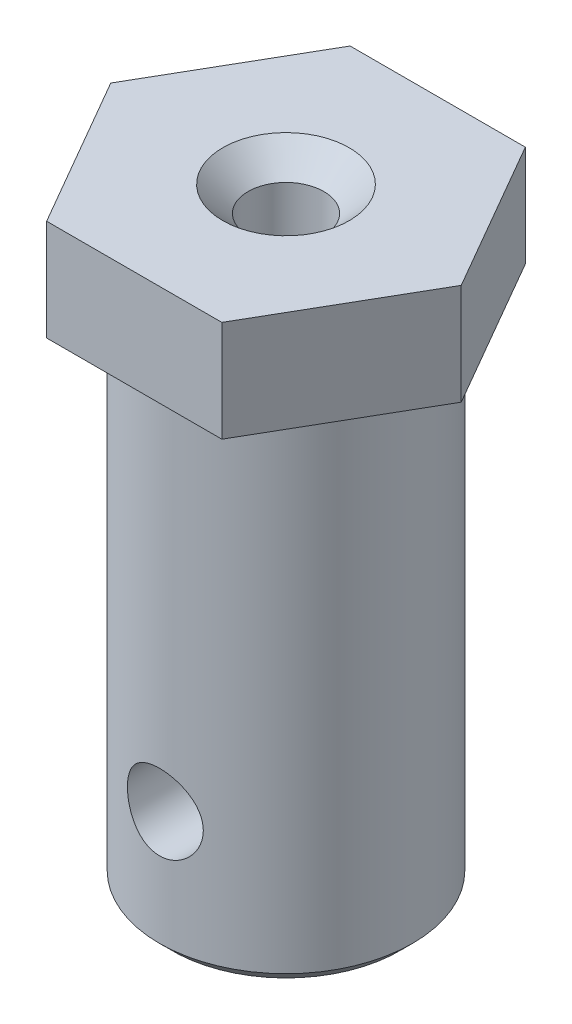
ISO-10303-21;
HEADER;
FILE_DESCRIPTION(('STEP AP214'),'2;1');
FILE_NAME('part.step','',(''),(''),'','','');
FILE_SCHEMA(('AUTOMOTIVE_DESIGN { 1 0 10303 214 1 1 1 1 }'));
ENDSEC;
DATA;
#1=APPLICATION_CONTEXT('core data for automotive mechanical design processes');
#2=APPLICATION_PROTOCOL_DEFINITION('international standard','automotive_design',2000,#1);
#3=PRODUCT_CONTEXT('',#1,'mechanical');
#4=PRODUCT('Part','Part','',(#3));
#5=PRODUCT_RELATED_PRODUCT_CATEGORY('part','',(#4));
#6=PRODUCT_DEFINITION_FORMATION('','',#4);
#7=PRODUCT_DEFINITION_CONTEXT('part definition',#1,'design');
#8=PRODUCT_DEFINITION('design','',#6,#7);
#9=PRODUCT_DEFINITION_SHAPE('','',#8);
#10=(LENGTH_UNIT() NAMED_UNIT(*) SI_UNIT(.MILLI.,.METRE.));
#11=(NAMED_UNIT(*) PLANE_ANGLE_UNIT() SI_UNIT($,.RADIAN.));
#12=(NAMED_UNIT(*) SI_UNIT($,.STERADIAN.) SOLID_ANGLE_UNIT());
#13=UNCERTAINTY_MEASURE_WITH_UNIT(LENGTH_MEASURE(1.E-05),#10,'distance_accuracy_value','');
#14=(GEOMETRIC_REPRESENTATION_CONTEXT(3) GLOBAL_UNCERTAINTY_ASSIGNED_CONTEXT((#13)) GLOBAL_UNIT_ASSIGNED_CONTEXT((#10,
#11,#12)) REPRESENTATION_CONTEXT('',''));
#15=CARTESIAN_POINT('',(0.,0.,0.));
#16=DIRECTION('',(0.,0.,1.));
#17=DIRECTION('',(1.,0.,0.));
#18=AXIS2_PLACEMENT_3D('',#15,#16,#17);
#19=CARTESIAN_POINT('',(3.46410161513779,4.,5.99999999999999));
#20=DIRECTION('',(-0.866025403784438,0.,-0.500000000000001));
#21=DIRECTION('',(-0.500000000000001,0.,0.866025403784438));
#22=AXIS2_PLACEMENT_3D('',#19,#20,#21);
#23=PLANE('',#22);
#24=DIRECTION('',(0.500000000000001,0.,-0.866025403784438));
#25=VECTOR('',#24,1.);
#26=CARTESIAN_POINT('',(3.46410161513779,0.,5.99999999999999));
#27=LINE('',#26,#25);
#28=CARTESIAN_POINT('',(3.46410161513779,0.,5.99999999999999));
#29=VERTEX_POINT('',#28);
#30=CARTESIAN_POINT('',(6.92820323027551,0.,0.));
#31=VERTEX_POINT('',#30);
#32=EDGE_CURVE('E125',#29,#31,#27,.T.);
#33=ORIENTED_EDGE('',*,*,#32,.T.);
#34=DIRECTION('',(0.,-1.,0.));
#35=VECTOR('',#34,1.);
#36=CARTESIAN_POINT('',(6.92820323027551,4.,0.));
#37=LINE('',#36,#35);
#38=CARTESIAN_POINT('',(6.92820323027551,4.,0.));
#39=VERTEX_POINT('',#38);
#40=EDGE_CURVE('E143',#39,#31,#37,.T.);
#41=ORIENTED_EDGE('',*,*,#40,.F.);
#42=DIRECTION('',(0.500000000000001,0.,-0.866025403784438));
#43=VECTOR('',#42,1.);
#44=CARTESIAN_POINT('',(3.46410161513779,4.,5.99999999999999));
#45=LINE('',#44,#43);
#46=CARTESIAN_POINT('',(3.46410161513779,4.,5.99999999999999));
#47=VERTEX_POINT('',#46);
#48=EDGE_CURVE('E136',#47,#39,#45,.T.);
#49=ORIENTED_EDGE('',*,*,#48,.F.);
#50=DIRECTION('',(0.,-1.,0.));
#51=VECTOR('',#50,1.);
#52=CARTESIAN_POINT('',(3.46410161513779,4.,5.99999999999999));
#53=LINE('',#52,#51);
#54=EDGE_CURVE('E121',#47,#29,#53,.T.);
#55=ORIENTED_EDGE('',*,*,#54,.T.);
#56=EDGE_LOOP('',(#33,#41,#49,#55));
#57=FACE_BOUND('',#56,.T.);
#58=ADVANCED_FACE('F38',(#57),#23,.F.);
#59=CARTESIAN_POINT('',(6.92820323027551,4.,0.));
#60=DIRECTION('',(-0.86602540378444,0.,0.499999999999998));
#61=DIRECTION('',(0.499999999999998,0.,0.86602540378444));
#62=AXIS2_PLACEMENT_3D('',#59,#60,#61);
#63=PLANE('',#62);
#64=DIRECTION('',(-0.499999999999998,0.,-0.86602540378444));
#65=VECTOR('',#64,1.);
#66=CARTESIAN_POINT('',(6.92820323027551,0.,0.));
#67=LINE('',#66,#65);
#68=CARTESIAN_POINT('',(3.46410161513774,0.,-6.));
#69=VERTEX_POINT('',#68);
#70=EDGE_CURVE('E128',#31,#69,#67,.T.);
#71=ORIENTED_EDGE('',*,*,#70,.T.);
#72=DIRECTION('',(0.,-1.,0.));
#73=VECTOR('',#72,1.);
#74=CARTESIAN_POINT('',(3.46410161513774,4.,-6.));
#75=LINE('',#74,#73);
#76=CARTESIAN_POINT('',(3.46410161513774,4.,-6.));
#77=VERTEX_POINT('',#76);
#78=EDGE_CURVE('E140',#77,#69,#75,.T.);
#79=ORIENTED_EDGE('',*,*,#78,.F.);
#80=DIRECTION('',(-0.499999999999998,0.,-0.86602540378444));
#81=VECTOR('',#80,1.);
#82=CARTESIAN_POINT('',(6.92820323027551,4.,0.));
#83=LINE('',#82,#81);
#84=EDGE_CURVE('E94',#39,#77,#83,.T.);
#85=ORIENTED_EDGE('',*,*,#84,.F.);
#86=ORIENTED_EDGE('',*,*,#40,.T.);
#87=EDGE_LOOP('',(#71,#79,#85,#86));
#88=FACE_BOUND('',#87,.T.);
#89=ADVANCED_FACE('F214',(#88),#63,.F.);
#90=CARTESIAN_POINT('',(3.46410161513774,4.,-6.));
#91=DIRECTION('',(0.,0.,1.));
#92=DIRECTION('',(1.,0.,0.));
#93=AXIS2_PLACEMENT_3D('',#90,#91,#92);
#94=PLANE('',#93);
#95=DIRECTION('',(-1.,0.,0.));
#96=VECTOR('',#95,1.);
#97=CARTESIAN_POINT('',(3.46410161513774,0.,-6.));
#98=LINE('',#97,#96);
#99=CARTESIAN_POINT('',(-3.46410161513776,0.,-6.));
#100=VERTEX_POINT('',#99);
#101=EDGE_CURVE('E131',#69,#100,#98,.T.);
#102=ORIENTED_EDGE('',*,*,#101,.T.);
#103=DIRECTION('',(0.,-1.,0.));
#104=VECTOR('',#103,1.);
#105=CARTESIAN_POINT('',(-3.46410161513776,4.,-6.));
#106=LINE('',#105,#104);
#107=CARTESIAN_POINT('',(-3.46410161513776,4.,-6.));
#108=VERTEX_POINT('',#107);
#109=EDGE_CURVE('E116',#108,#100,#106,.T.);
#110=ORIENTED_EDGE('',*,*,#109,.F.);
#111=DIRECTION('',(-1.,0.,0.));
#112=VECTOR('',#111,1.);
#113=CARTESIAN_POINT('',(3.46410161513774,4.,-6.));
#114=LINE('',#113,#112);
#115=EDGE_CURVE('E107',#77,#108,#114,.T.);
#116=ORIENTED_EDGE('',*,*,#115,.F.);
#117=ORIENTED_EDGE('',*,*,#78,.T.);
#118=EDGE_LOOP('',(#102,#110,#116,#117));
#119=FACE_BOUND('',#118,.T.);
#120=ADVANCED_FACE('F211',(#119),#94,.F.);
#121=CARTESIAN_POINT('',(-3.46410161513776,4.,-6.));
#122=DIRECTION('',(0.866025403784439,0.,0.5));
#123=DIRECTION('',(0.5,0.,-0.866025403784439));
#124=AXIS2_PLACEMENT_3D('',#121,#122,#123);
#125=PLANE('',#124);
#126=DIRECTION('',(-0.5,0.,0.866025403784439));
#127=VECTOR('',#126,1.);
#128=CARTESIAN_POINT('',(-3.46410161513776,0.,-6.));
#129=LINE('',#128,#127);
#130=CARTESIAN_POINT('',(-6.92820323027551,0.,0.));
#131=VERTEX_POINT('',#130);
#132=EDGE_CURVE('E115',#100,#131,#129,.T.);
#133=ORIENTED_EDGE('',*,*,#132,.T.);
#134=DIRECTION('',(0.,-1.,0.));
#135=VECTOR('',#134,1.);
#136=CARTESIAN_POINT('',(-6.92820323027551,4.,0.));
#137=LINE('',#136,#135);
#138=CARTESIAN_POINT('',(-6.92820323027551,4.,0.));
#139=VERTEX_POINT('',#138);
#140=EDGE_CURVE('E112',#139,#131,#137,.T.);
#141=ORIENTED_EDGE('',*,*,#140,.F.);
#142=DIRECTION('',(-0.5,0.,0.866025403784439));
#143=VECTOR('',#142,1.);
#144=CARTESIAN_POINT('',(-3.46410161513776,4.,-6.));
#145=LINE('',#144,#143);
#146=EDGE_CURVE('E101',#108,#139,#145,.T.);
#147=ORIENTED_EDGE('',*,*,#146,.F.);
#148=ORIENTED_EDGE('',*,*,#109,.T.);
#149=EDGE_LOOP('',(#133,#141,#147,#148));
#150=FACE_BOUND('',#149,.T.);
#151=ADVANCED_FACE('F113',(#150),#125,.F.);
#152=CARTESIAN_POINT('',(-6.92820323027551,4.,0.));
#153=DIRECTION('',(0.866025403784438,0.,-0.5));
#154=DIRECTION('',(-0.5,0.,-0.866025403784438));
#155=AXIS2_PLACEMENT_3D('',#152,#153,#154);
#156=PLANE('',#155);
#157=DIRECTION('',(0.5,0.,0.866025403784438));
#158=VECTOR('',#157,1.);
#159=CARTESIAN_POINT('',(-6.92820323027551,0.,0.));
#160=LINE('',#159,#158);
#161=CARTESIAN_POINT('',(-3.46410161513774,0.,6.00000000000001));
#162=VERTEX_POINT('',#161);
#163=EDGE_CURVE('E79',#131,#162,#160,.T.);
#164=ORIENTED_EDGE('',*,*,#163,.T.);
#165=DIRECTION('',(0.,-1.,0.));
#166=VECTOR('',#165,1.);
#167=CARTESIAN_POINT('',(-3.46410161513774,4.,6.00000000000001));
#168=LINE('',#167,#166);
#169=CARTESIAN_POINT('',(-3.46410161513774,4.,6.00000000000001));
#170=VERTEX_POINT('',#169);
#171=EDGE_CURVE('E117',#170,#162,#168,.T.);
#172=ORIENTED_EDGE('',*,*,#171,.F.);
#173=DIRECTION('',(0.5,0.,0.866025403784438));
#174=VECTOR('',#173,1.);
#175=CARTESIAN_POINT('',(-6.92820323027551,4.,0.));
#176=LINE('',#175,#174);
#177=EDGE_CURVE('E105',#139,#170,#176,.T.);
#178=ORIENTED_EDGE('',*,*,#177,.F.);
#179=ORIENTED_EDGE('',*,*,#140,.T.);
#180=EDGE_LOOP('',(#164,#172,#178,#179));
#181=FACE_BOUND('',#180,.T.);
#182=ADVANCED_FACE('F119',(#181),#156,.F.);
#183=CARTESIAN_POINT('',(-3.46410161513774,4.,6.00000000000001));
#184=DIRECTION('',(0.,0.,-1.));
#185=DIRECTION('',(-1.,0.,0.));
#186=AXIS2_PLACEMENT_3D('',#183,#184,#185);
#187=PLANE('',#186);
#188=DIRECTION('',(1.,0.,0.));
#189=VECTOR('',#188,1.);
#190=CARTESIAN_POINT('',(-3.46410161513774,0.,6.00000000000001));
#191=LINE('',#190,#189);
#192=EDGE_CURVE('E85',#162,#29,#191,.T.);
#193=ORIENTED_EDGE('',*,*,#192,.T.);
#194=ORIENTED_EDGE('',*,*,#54,.F.);
#195=DIRECTION('',(1.,0.,0.));
#196=VECTOR('',#195,1.);
#197=CARTESIAN_POINT('',(-3.46410161513774,4.,6.00000000000001));
#198=LINE('',#197,#196);
#199=EDGE_CURVE('E56',#170,#47,#198,.T.);
#200=ORIENTED_EDGE('',*,*,#199,.F.);
#201=ORIENTED_EDGE('',*,*,#171,.T.);
#202=EDGE_LOOP('',(#193,#194,#200,#201));
#203=FACE_BOUND('',#202,.T.);
#204=ADVANCED_FACE('F200',(#203),#187,.F.);
#205=CARTESIAN_POINT('',(0.,4.,0.));
#206=DIRECTION('',(0.,1.,0.));
#207=DIRECTION('',(0.,0.,1.));
#208=AXIS2_PLACEMENT_3D('',#205,#206,#207);
#209=PLANE('',#208);
#210=CARTESIAN_POINT('',(0.,4.,0.));
#211=DIRECTION('',(0.,1.,0.));
#212=DIRECTION('',(0.,0.,1.));
#213=AXIS2_PLACEMENT_3D('',#210,#211,#212);
#214=CIRCLE('',#213,2.5);
#215=CARTESIAN_POINT('',(0.,4.,2.5));
#216=VERTEX_POINT('',#215);
#217=EDGE_CURVE('E11',#216,#216,#214,.F.);
#218=ORIENTED_EDGE('',*,*,#217,.T.);
#219=EDGE_LOOP('',(#218));
#220=FACE_BOUND('',#219,.T.);
#221=ORIENTED_EDGE('',*,*,#48,.T.);
#222=ORIENTED_EDGE('',*,*,#84,.T.);
#223=ORIENTED_EDGE('',*,*,#115,.T.);
#224=ORIENTED_EDGE('',*,*,#146,.T.);
#225=ORIENTED_EDGE('',*,*,#177,.T.);
#226=ORIENTED_EDGE('',*,*,#199,.T.);
#227=EDGE_LOOP('',(#221,#222,#223,#224,#225,#226));
#228=FACE_BOUND('',#227,.T.);
#229=ADVANCED_FACE('F103',(#220,#228),#209,.T.);
#230=CARTESIAN_POINT('',(0.,0.,0.));
#231=DIRECTION('',(0.,1.,0.));
#232=DIRECTION('',(0.,0.,1.));
#233=AXIS2_PLACEMENT_3D('',#230,#231,#232);
#234=PLANE('',#233);
#235=CARTESIAN_POINT('',(0.,0.,0.));
#236=DIRECTION('',(0.,1.,0.));
#237=DIRECTION('',(0.,0.,1.));
#238=AXIS2_PLACEMENT_3D('',#235,#236,#237);
#239=CIRCLE('',#238,5.5);
#240=CARTESIAN_POINT('',(0.,0.,5.5));
#241=VERTEX_POINT('',#240);
#242=EDGE_CURVE('E148',#241,#241,#239,.T.);
#243=ORIENTED_EDGE('',*,*,#242,.T.);
#244=EDGE_LOOP('',(#243));
#245=FACE_BOUND('',#244,.T.);
#246=ORIENTED_EDGE('',*,*,#32,.F.);
#247=ORIENTED_EDGE('',*,*,#192,.F.);
#248=ORIENTED_EDGE('',*,*,#163,.F.);
#249=ORIENTED_EDGE('',*,*,#132,.F.);
#250=ORIENTED_EDGE('',*,*,#101,.F.);
#251=ORIENTED_EDGE('',*,*,#70,.F.);
#252=EDGE_LOOP('',(#246,#247,#248,#249,#250,#251));
#253=FACE_BOUND('',#252,.T.);
#254=ADVANCED_FACE('F196',(#245,#253),#234,.F.);
#255=CARTESIAN_POINT('',(0.,-20.,0.));
#256=DIRECTION('',(0.,1.,0.));
#257=DIRECTION('',(0.,0.,1.));
#258=AXIS2_PLACEMENT_3D('',#255,#256,#257);
#259=CYLINDRICAL_SURFACE('',#258,5.);
#260=CARTESIAN_POINT('',(0.,-16.5,5.));
#261=CARTESIAN_POINT('',(-0.0822886127532999,-16.4999990025151,4.9999992925055));
#262=CARTESIAN_POINT('',(-0.164587318351529,-16.493206136376,4.99794915693954));
#263=CARTESIAN_POINT('',(-0.32678812530488,-16.4662786457779,4.98997105593691));
#264=CARTESIAN_POINT('',(-0.406689504411419,-16.4461400419767,4.98404193389692));
#265=CARTESIAN_POINT('',(-0.561732707754526,-16.3932539830897,4.96895552501836));
#266=CARTESIAN_POINT('',(-0.636881364395372,-16.3605251303811,4.95980300250425));
#267=CARTESIAN_POINT('',(-0.78062418105313,-16.2834639069442,4.93922109237645));
#268=CARTESIAN_POINT('',(-0.849217467469667,-16.2391299926046,4.92779140192067));
#269=CARTESIAN_POINT('',(-0.979871797183741,-16.1387759925273,4.90350737192774));
#270=CARTESIAN_POINT('',(-1.04171807124434,-16.0824833741141,4.89062383657036));
#271=CARTESIAN_POINT('',(-1.15524920923323,-15.9603907700898,4.86505834210442));
#272=CARTESIAN_POINT('',(-1.2069323632744,-15.894589187875,4.85237641724502));
#273=CARTESIAN_POINT('',(-1.29980037723707,-15.7535292469624,4.82834113993772));
#274=CARTESIAN_POINT('',(-1.34072309022213,-15.6780915390092,4.81702406663875));
#275=CARTESIAN_POINT('',(-1.40921394774759,-15.5210107457697,4.79743620394031));
#276=CARTESIAN_POINT('',(-1.43678529919972,-15.439369156072,4.78916468313311));
#277=CARTESIAN_POINT('',(-1.47701633682651,-15.2746097338695,4.77690870838435));
#278=CARTESIAN_POINT('',(-1.49007196234676,-15.191597256136,4.77281069324534));
#279=CARTESIAN_POINT('',(-1.50213730614671,-15.0244668437832,4.76902789749768));
#280=CARTESIAN_POINT('',(-1.50115042761077,-14.9403491819409,4.76934204760572));
#281=CARTESIAN_POINT('',(-1.4854697719981,-14.7766160913915,4.77424744067778));
#282=CARTESIAN_POINT('',(-1.47127205262683,-14.6969477496377,4.77868388599141));
#283=CARTESIAN_POINT('',(-1.43037420427054,-14.5411802137265,4.79108356228625));
#284=CARTESIAN_POINT('',(-1.40367284141639,-14.4650813726257,4.79904714132351));
#285=CARTESIAN_POINT('',(-1.33816026653679,-14.3173996503392,4.81772733074974));
#286=CARTESIAN_POINT('',(-1.2991881693464,-14.2458929160447,4.82848016115953));
#287=CARTESIAN_POINT('',(-1.21035222588681,-14.1102679779898,4.85150987000065));
#288=CARTESIAN_POINT('',(-1.16048574002586,-14.0461515705862,4.86378711746992));
#289=CARTESIAN_POINT('',(-1.04881290765544,-13.924313809238,4.88911011297938));
#290=CARTESIAN_POINT('',(-0.986594907466945,-13.8669713359703,4.90216654310498));
#291=CARTESIAN_POINT('',(-0.853263259313939,-13.7634460159357,4.92712244063259));
#292=CARTESIAN_POINT('',(-0.782149051860859,-13.7172638715856,4.93902183518411));
#293=CARTESIAN_POINT('',(-0.632355038342773,-13.6371400775353,4.96043160069471));
#294=CARTESIAN_POINT('',(-0.55362774974792,-13.6032824837501,4.96992543668314));
#295=CARTESIAN_POINT('',(-0.391245415603488,-13.5494004099004,4.98533521832222));
#296=CARTESIAN_POINT('',(-0.30759175158955,-13.5293720714675,4.99125216187));
#297=CARTESIAN_POINT('',(-0.1409522426683,-13.5043478221006,4.99868364643539));
#298=CARTESIAN_POINT('',(-0.0580500976011559,-13.4988384141984,5.0003485041779));
#299=CARTESIAN_POINT('',(0.107499605823413,-13.5015691557121,4.99952923241759));
#300=CARTESIAN_POINT('',(0.190147196690811,-13.5098074696514,4.99704565677756));
#301=CARTESIAN_POINT('',(0.350903605309726,-13.5393846111115,4.98830696987163));
#302=CARTESIAN_POINT('',(0.429072772614199,-13.5604233875809,4.98213829799416));
#303=CARTESIAN_POINT('',(0.58075463895455,-13.6146432327782,4.96674347841532));
#304=CARTESIAN_POINT('',(0.654266777025612,-13.6478257610379,4.95751696321084));
#305=CARTESIAN_POINT('',(0.79643718946108,-13.7262531654811,4.93669654351324));
#306=CARTESIAN_POINT('',(0.864943826199697,-13.771759340948,4.92505280829674));
#307=CARTESIAN_POINT('',(0.993523307980174,-13.8732247540528,4.90073468764317));
#308=CARTESIAN_POINT('',(1.05359403235596,-13.9291866118877,4.88806004431079));
#309=CARTESIAN_POINT('',(1.16585744551029,-14.0523873083694,4.86253171869137));
#310=CARTESIAN_POINT('',(1.21768481231506,-14.1199618757718,4.84968825033267));
#311=CARTESIAN_POINT('',(1.30928995072156,-14.2631279390135,4.82576515238463));
#312=CARTESIAN_POINT('',(1.34906803829474,-14.3387192245582,4.81468547654651));
#313=CARTESIAN_POINT('',(1.4151734712717,-14.4955324912547,4.79567189615054));
#314=CARTESIAN_POINT('',(1.44156346937052,-14.5767261865366,4.78772337843826));
#315=CARTESIAN_POINT('',(1.48021730815116,-14.7426879689315,4.77591594362794));
#316=CARTESIAN_POINT('',(1.49248598978781,-14.8274548207877,4.772055625083));
#317=CARTESIAN_POINT('',(1.5022198448506,-14.9943615183762,4.76899972496086));
#318=CARTESIAN_POINT('',(1.50028055308491,-15.0764636510176,4.76961647442754));
#319=CARTESIAN_POINT('',(1.48307505444815,-15.2391141033728,4.77499401288294));
#320=CARTESIAN_POINT('',(1.46780938124717,-15.3196624851764,4.77975463592551));
#321=CARTESIAN_POINT('',(1.42476888804137,-15.4759453991429,4.79275763670385));
#322=CARTESIAN_POINT('',(1.39715175507069,-15.5517272873617,4.80095604545964));
#323=CARTESIAN_POINT('',(1.3303150712113,-15.6976424388177,4.81990278909136));
#324=CARTESIAN_POINT('',(1.29109329962877,-15.7677746176408,4.83065161194312));
#325=CARTESIAN_POINT('',(1.20048763805073,-15.9031631165271,4.85397676425833));
#326=CARTESIAN_POINT('',(1.14871276092994,-15.9681487612604,4.86660540163797));
#327=CARTESIAN_POINT('',(1.03517434629782,-16.0887024983079,4.89201320450026));
#328=CARTESIAN_POINT('',(0.973408217134503,-16.1442681394678,4.90479240823905));
#329=CARTESIAN_POINT('',(0.83946576218325,-16.246023412295,4.92950936570649));
#330=CARTESIAN_POINT('',(0.767037885790608,-16.2918914468555,4.94141159765674));
#331=CARTESIAN_POINT('',(0.61514137398353,-16.370735169904,4.96260680455813));
#332=CARTESIAN_POINT('',(0.535676052998956,-16.4037168882745,4.97190099931067));
#333=CARTESIAN_POINT('',(0.380757712655282,-16.4528952756528,4.98602174969301));
#334=CARTESIAN_POINT('',(0.305786961954235,-16.4705116728833,4.99122027381068));
#335=CARTESIAN_POINT('',(0.153880195230779,-16.4940635252416,4.99820944494492));
#336=CARTESIAN_POINT('',(0.0769445098581395,-16.5000009327048,5.0000006615474));
#337=CARTESIAN_POINT('',(0.,-16.5,5.));
#338=B_SPLINE_CURVE_WITH_KNOTS('',3,(#260,#261,#262,#263,#264,#265,#266,#267,#268,#269,#270,
#271,#272,#273,#274,#275,#276,#277,#278,#279,#280,#281,#282,#283,#284,#285,#286,#287,#288,#289,
#290,#291,#292,#293,#294,#295,#296,#297,#298,#299,#300,#301,#302,#303,#304,#305,#306,#307,#308,
#309,#310,#311,#312,#313,#314,#315,#316,#317,#318,#319,#320,#321,#322,#323,#324,#325,#326,#327,
#328,#329,#330,#331,#332,#333,#334,#335,#336,#337),.UNSPECIFIED.,.T.,.F.,(4,2,2,2,2,2,2,2,2,2,2,
2,2,2,2,2,2,2,2,2,2,2,2,2,2,2,2,2,2,2,2,2,2,2,2,2,2,2,4),(0.,0.24658320361261,0.493239964846,
0.739533676300876,0.985860164412702,1.23855602948191,1.49129437288633,1.74971481004109,
2.00807314543224,2.25919689356599,2.51025978319089,2.75226016697676,2.99428443658001,
3.23962426447119,3.48502360158555,3.74067104048167,3.99633456531072,4.25371046881689,
4.51101453528808,4.75908809438545,5.00712853550327,5.24956746682327,5.49203554593729,
5.74011305702908,5.98825282000191,6.24540400322819,6.5025484425268,6.75847814951252,
7.01432009460283,7.25950155466943,7.504673196616,7.74680040402721,7.98897397553107,
8.23996925679931,8.49102974897502,8.74942996156671,9.00770911595235,9.23831691930459,
9.46888616948874),.UNSPECIFIED.);
#339=CARTESIAN_POINT('',(0.,-16.5,5.));
#340=VERTEX_POINT('',#339);
#341=EDGE_CURVE('E161',#340,#340,#338,.T.);
#342=ORIENTED_EDGE('',*,*,#341,.T.);
#343=EDGE_LOOP('',(#342));
#344=FACE_BOUND('',#343,.T.);
#345=CARTESIAN_POINT('',(0.,-19.5,0.));
#346=DIRECTION('',(0.,-1.,0.));
#347=DIRECTION('',(0.,0.,-1.));
#348=AXIS2_PLACEMENT_3D('',#345,#346,#347);
#349=CIRCLE('',#348,5.);
#350=CARTESIAN_POINT('',(0.,-19.5,-5.));
#351=VERTEX_POINT('',#350);
#352=EDGE_CURVE('E154',#351,#351,#349,.F.);
#353=ORIENTED_EDGE('',*,*,#352,.T.);
#354=EDGE_LOOP('',(#353));
#355=FACE_BOUND('',#354,.T.);
#356=CARTESIAN_POINT('',(0.,-0.5,0.));
#357=DIRECTION('',(0.,1.,0.));
#358=DIRECTION('',(0.,0.,1.));
#359=AXIS2_PLACEMENT_3D('',#356,#357,#358);
#360=CIRCLE('',#359,5.);
#361=CARTESIAN_POINT('',(0.,-0.5,5.));
#362=VERTEX_POINT('',#361);
#363=EDGE_CURVE('E145',#362,#362,#360,.F.);
#364=ORIENTED_EDGE('',*,*,#363,.T.);
#365=EDGE_LOOP('',(#364));
#366=FACE_BOUND('',#365,.T.);
#367=ADVANCED_FACE('F191',(#344,#355,#366),#259,.T.);
#368=CARTESIAN_POINT('',(0.,-20.,0.));
#369=DIRECTION('',(0.,-1.,0.));
#370=DIRECTION('',(0.,0.,-1.));
#371=AXIS2_PLACEMENT_3D('',#368,#369,#370);
#372=PLANE('',#371);
#373=CARTESIAN_POINT('',(0.,-20.,0.));
#374=DIRECTION('',(0.,-1.,0.));
#375=DIRECTION('',(0.,0.,-1.));
#376=AXIS2_PLACEMENT_3D('',#373,#374,#375);
#377=CIRCLE('',#376,3.5);
#378=CARTESIAN_POINT('',(0.,-20.,-3.5));
#379=VERTEX_POINT('',#378);
#380=EDGE_CURVE('E243',#379,#379,#377,.F.);
#381=ORIENTED_EDGE('',*,*,#380,.T.);
#382=EDGE_LOOP('',(#381));
#383=FACE_BOUND('',#382,.T.);
#384=CARTESIAN_POINT('',(0.,-20.,0.));
#385=DIRECTION('',(0.,-1.,0.));
#386=DIRECTION('',(0.,0.,-1.));
#387=AXIS2_PLACEMENT_3D('',#384,#385,#386);
#388=CIRCLE('',#387,4.5);
#389=CARTESIAN_POINT('',(0.,-20.,-4.5));
#390=VERTEX_POINT('',#389);
#391=EDGE_CURVE('E151',#390,#390,#388,.T.);
#392=ORIENTED_EDGE('',*,*,#391,.T.);
#393=EDGE_LOOP('',(#392));
#394=FACE_BOUND('',#393,.T.);
#395=ADVANCED_FACE('F195',(#383,#394),#372,.T.);
#396=CARTESIAN_POINT('',(0.,-0.5,0.));
#397=DIRECTION('',(0.,1.,0.));
#398=DIRECTION('',(0.,0.,1.));
#399=AXIS2_PLACEMENT_3D('',#396,#397,#398);
#400=TOROIDAL_SURFACE('',#399,5.5,0.5);
#401=ORIENTED_EDGE('',*,*,#242,.F.);
#402=EDGE_LOOP('',(#401));
#403=FACE_BOUND('',#402,.T.);
#404=ORIENTED_EDGE('',*,*,#363,.F.);
#405=EDGE_LOOP('',(#404));
#406=FACE_BOUND('',#405,.T.);
#407=ADVANCED_FACE('F221',(#403,#406),#400,.F.);
#408=CARTESIAN_POINT('',(0.,-20.,0.));
#409=DIRECTION('',(0.,1.,0.));
#410=DIRECTION('',(0.,0.,1.));
#411=AXIS2_PLACEMENT_3D('',#408,#409,#410);
#412=CONICAL_SURFACE('',#411,4.5,0.785398163397444);
#413=ORIENTED_EDGE('',*,*,#352,.F.);
#414=EDGE_LOOP('',(#413));
#415=FACE_BOUND('',#414,.T.);
#416=ORIENTED_EDGE('',*,*,#391,.F.);
#417=EDGE_LOOP('',(#416));
#418=FACE_BOUND('',#417,.T.);
#419=ADVANCED_FACE('F224',(#415,#418),#412,.T.);
#420=CARTESIAN_POINT('',(0.,-5.,0.));
#421=DIRECTION('',(0.,-1.,0.));
#422=DIRECTION('',(0.,0.,-1.));
#423=AXIS2_PLACEMENT_3D('',#420,#421,#422);
#424=CYLINDRICAL_SURFACE('',#423,2.5);
#425=CARTESIAN_POINT('',(0.,-19.,0.));
#426=DIRECTION('',(0.,-1.,0.));
#427=DIRECTION('',(0.,0.,-1.));
#428=AXIS2_PLACEMENT_3D('',#425,#426,#427);
#429=CIRCLE('',#428,2.5);
#430=CARTESIAN_POINT('',(0.,-19.,-2.5));
#431=VERTEX_POINT('',#430);
#432=EDGE_CURVE('E157',#431,#431,#429,.T.);
#433=ORIENTED_EDGE('',*,*,#432,.T.);
#434=EDGE_LOOP('',(#433));
#435=FACE_BOUND('',#434,.T.);
#436=CARTESIAN_POINT('',(1.50000000000001,-15.,1.99999999999999));
#437=CARTESIAN_POINT('',(1.50000404108593,-14.9245210247104,1.9999941664251));
#438=CARTESIAN_POINT('',(1.49426852824015,-14.8490615659202,2.0043363390348));
#439=CARTESIAN_POINT('',(1.47174965152789,-14.7006760960378,2.02092590613882));
#440=CARTESIAN_POINT('',(1.45495475788937,-14.6277528126149,2.03318155043096));
#441=CARTESIAN_POINT('',(1.41143486335797,-14.4869163583227,2.06362339034729));
#442=CARTESIAN_POINT('',(1.38478154503151,-14.4189711619647,2.08176666183119));
#443=CARTESIAN_POINT('',(1.32252909283021,-14.2885625466321,2.12185904995835));
#444=CARTESIAN_POINT('',(1.28692729054695,-14.2261007703049,2.14380930122415));
#445=CARTESIAN_POINT('',(1.20271292747646,-14.1000509833359,2.19228594587541));
#446=CARTESIAN_POINT('',(1.1530417943529,-14.0372590428761,2.21904371037661));
#447=CARTESIAN_POINT('',(1.04426801309986,-13.9202352372582,2.2722622943106));
#448=CARTESIAN_POINT('',(0.98515829672963,-13.8660098483292,2.29872287517102));
#449=CARTESIAN_POINT('',(0.851442367411719,-13.7618661902903,2.35175567858733));
#450=CARTESIAN_POINT('',(0.775851995162566,-13.7130455363302,2.37803133577817));
#451=CARTESIAN_POINT('',(0.615654228271676,-13.6291902775556,2.42443786983179));
#452=CARTESIAN_POINT('',(0.531055196626347,-13.5941430258773,2.44457437988735));
#453=CARTESIAN_POINT('',(0.363771406742683,-13.5424040771874,2.4747098780044));
#454=CARTESIAN_POINT('',(0.281674698130932,-13.5242796390327,2.4854930393917));
#455=CARTESIAN_POINT('',(0.114970509382725,-13.5020571971369,2.49874939277545));
#456=CARTESIAN_POINT('',(0.0303654624001694,-13.4979460219999,2.50123038813307));
#457=CARTESIAN_POINT('',(-0.127637283737294,-13.5036137473425,2.49783372711539));
#458=CARTESIAN_POINT('',(-0.201123832865619,-13.5117335261693,2.49295437513726));
#459=CARTESIAN_POINT('',(-0.345464269151752,-13.5384797956481,2.47707997553857));
#460=CARTESIAN_POINT('',(-0.416317961051186,-13.5571070639072,2.46608447529309));
#461=CARTESIAN_POINT('',(-0.554056780469064,-13.6041655627038,2.4388490720172));
#462=CARTESIAN_POINT('',(-0.620916491037601,-13.632653061139,2.42257910450824));
#463=CARTESIAN_POINT('',(-0.748988660115595,-13.6983846162255,2.38609637638749));
#464=CARTESIAN_POINT('',(-0.810199646207995,-13.735630947059,2.36588259201812));
#465=CARTESIAN_POINT('',(-0.933074267143184,-13.8228390928045,2.32037925976363));
#466=CARTESIAN_POINT('',(-0.993918663198178,-13.8737883117357,2.29477182952151));
#467=CARTESIAN_POINT('',(-1.10671465909273,-13.9844041178602,2.24255554245602));
#468=CARTESIAN_POINT('',(-1.15865401308338,-14.0440825034745,2.21594536703376));
#469=CARTESIAN_POINT('',(-1.25824837767416,-14.1786534061636,2.16111075123947));
#470=CARTESIAN_POINT('',(-1.3047093318863,-14.2545075765395,2.13305661385125));
#471=CARTESIAN_POINT('',(-1.3839721719423,-14.4147062316366,2.08250879557268));
#472=CARTESIAN_POINT('',(-1.41679921962187,-14.4990347161256,2.06000490298822));
#473=CARTESIAN_POINT('',(-1.46077497064841,-14.6523936318953,2.02895865196732));
#474=CARTESIAN_POINT('',(-1.47527903312663,-14.7200406322966,2.01833888618317));
#475=CARTESIAN_POINT('',(-1.49480872755282,-14.8573736102995,2.00392150777559));
#476=CARTESIAN_POINT('',(-1.49984538302906,-14.9270571204846,2.00011596115117));
#477=CARTESIAN_POINT('',(-1.50014781114181,-15.0665516824357,1.99988914321324));
#478=CARTESIAN_POINT('',(-1.49540004697657,-15.1363627772152,2.00347810223985));
#479=CARTESIAN_POINT('',(-1.4764029057494,-15.2739873437486,2.01751520788653));
#480=CARTESIAN_POINT('',(-1.46214601830138,-15.3417991922403,2.02796877613214));
#481=CARTESIAN_POINT('',(-1.42488312618656,-15.4737145794798,2.05431768333101));
#482=CARTESIAN_POINT('',(-1.4018880525736,-15.5378226365322,2.07020622092813));
#483=CARTESIAN_POINT('',(-1.34796261057071,-15.6614777157302,2.10571539417588));
#484=CARTESIAN_POINT('',(-1.31702924888211,-15.721023006366,2.1253374369));
#485=CARTESIAN_POINT('',(-1.2416743955851,-15.8452400825122,2.17036819177738));
#486=CARTESIAN_POINT('',(-1.19582663060301,-15.9089008350966,2.1961823939737));
#487=CARTESIAN_POINT('',(-1.09487395518699,-16.0282854848495,2.24821754803621));
#488=CARTESIAN_POINT('',(-1.03976018672401,-16.0840016921691,2.27443886711455));
#489=CARTESIAN_POINT('',(-0.913274837212751,-16.1932240073504,2.32835625910914));
#490=CARTESIAN_POINT('',(-0.840721108780175,-16.2455007266058,2.3558007587587));
#491=CARTESIAN_POINT('',(-0.686103100868004,-16.3369027768367,2.40537639133459));
#492=CARTESIAN_POINT('',(-0.604045176134686,-16.3760368278409,2.42751104449411));
#493=CARTESIAN_POINT('',(-0.438840232972122,-16.4368682034314,2.46252280092775));
#494=CARTESIAN_POINT('',(-0.356205963651242,-16.4596262277911,2.47595588067329));
#495=CARTESIAN_POINT('',(-0.187383063890841,-16.4907146028463,2.494407389061));
#496=CARTESIAN_POINT('',(-0.101198571781953,-16.4990612907176,2.49943534582737));
#497=CARTESIAN_POINT('',(0.0598120232009998,-16.5006746085859,2.50040600461976));
#498=CARTESIAN_POINT('',(0.134620583589722,-16.495803334563,2.49747057186327));
#499=CARTESIAN_POINT('',(0.282148755978789,-16.4751061756184,2.48512948412095));
#500=CARTESIAN_POINT('',(0.354868344701929,-16.4592801686784,2.47572375706639));
#501=CARTESIAN_POINT('',(0.495145481978811,-16.4177804284162,2.45149427526961));
#502=CARTESIAN_POINT('',(0.562767032608845,-16.3922684038708,2.43675966858906));
#503=CARTESIAN_POINT('',(0.692781971999999,-16.3323594054452,2.40303337447154));
#504=CARTESIAN_POINT('',(0.755174184199847,-16.2979604391404,2.38404073252268));
#505=CARTESIAN_POINT('',(0.880263645295961,-16.2170748034312,2.3409343265938));
#506=CARTESIAN_POINT('',(0.942258690439953,-16.1696812909831,2.31648844639149));
#507=CARTESIAN_POINT('',(1.05789751536308,-16.0662469662823,2.2660190735066));
#508=CARTESIAN_POINT('',(1.11153190956917,-16.0101965743921,2.23999385274508));
#509=CARTESIAN_POINT('',(1.21590975350571,-15.8827144378223,2.18528165666204));
#510=CARTESIAN_POINT('',(1.26542406663369,-15.8102335138345,2.156675662709));
#511=CARTESIAN_POINT('',(1.35156817210326,-15.6565151472335,2.10376464485144));
#512=CARTESIAN_POINT('',(1.38820466322662,-15.5752822860186,2.07945738811051));
#513=CARTESIAN_POINT('',(1.44437116535134,-15.4129357148628,2.04080003047959));
#514=CARTESIAN_POINT('',(1.46509526060189,-15.3324047640388,2.02577665830137));
#515=CARTESIAN_POINT('',(1.49289268240428,-15.1679026052963,2.00539032320035));
#516=CARTESIAN_POINT('',(1.49999550595838,-15.0839392342413,2.00000648744642));
#517=CARTESIAN_POINT('',(1.50000000000001,-15.,1.99999999999999));
#518=B_SPLINE_CURVE_WITH_KNOTS('',3,(#436,#437,#438,#439,#440,#441,#442,#443,#444,#445,#446,
#447,#448,#449,#450,#451,#452,#453,#454,#455,#456,#457,#458,#459,#460,#461,#462,#463,#464,#465,
#466,#467,#468,#469,#470,#471,#472,#473,#474,#475,#476,#477,#478,#479,#480,#481,#482,#483,#484,
#485,#486,#487,#488,#489,#490,#491,#492,#493,#494,#495,#496,#497,#498,#499,#500,#501,#502,#503,
#504,#505,#506,#507,#508,#509,#510,#511,#512,#513,#514,#515,#516,#517),.UNSPECIFIED.,.T.,.F.,(4,
2,2,2,2,2,2,2,2,2,2,2,2,2,2,2,2,2,2,2,2,2,2,2,2,2,2,2,2,2,2,2,2,2,2,2,2,2,2,2,4),(0.,
0.226085249493392,0.452406574330769,0.677113624991877,0.90188776221593,1.15414462390001,
1.40659128601843,1.68630157736223,1.9657544327122,2.21853330858497,2.47107452602767,
2.69230130543182,2.91354445887945,3.13607155036376,3.35865648368878,3.60782810055849,
3.85733966656908,4.13576671140276,4.41367760154768,4.62276298054683,4.83160475643976,
5.04073566011182,5.25003193304128,5.45906724365495,5.66818149154661,5.91499438482002,
6.16204457978455,6.44121828011588,6.72020638384847,6.97891479383337,7.23732973022726,
7.46129321849399,7.68525920139648,7.90563970188756,8.12606965394584,8.37042963549487,
8.61506198741954,8.89071695766603,9.16622832484805,9.41820120134354,9.66962780912277),.UNSPECIFIED.);
#519=CARTESIAN_POINT('',(1.50000000000001,-15.,1.99999999999999));
#520=VERTEX_POINT('',#519);
#521=EDGE_CURVE('E162',#520,#520,#518,.T.);
#522=ORIENTED_EDGE('',*,*,#521,.T.);
#523=EDGE_LOOP('',(#522));
#524=FACE_BOUND('',#523,.T.);
#525=CARTESIAN_POINT('',(0.,-5.,0.));
#526=DIRECTION('',(0.,-1.,0.));
#527=DIRECTION('',(0.,0.,-1.));
#528=AXIS2_PLACEMENT_3D('',#525,#526,#527);
#529=CIRCLE('',#528,2.5);
#530=CARTESIAN_POINT('',(0.,-5.,-2.5));
#531=VERTEX_POINT('',#530);
#532=EDGE_CURVE('E129',#531,#531,#529,.T.);
#533=ORIENTED_EDGE('',*,*,#532,.F.);
#534=EDGE_LOOP('',(#533));
#535=FACE_BOUND('',#534,.T.);
#536=ADVANCED_FACE('F171',(#435,#524,#535),#424,.F.);
#537=CARTESIAN_POINT('',(0.,-5.,0.));
#538=DIRECTION('',(0.,-1.,0.));
#539=DIRECTION('',(0.,0.,-1.));
#540=AXIS2_PLACEMENT_3D('',#537,#538,#539);
#541=PLANE('',#540);
#542=CARTESIAN_POINT('',(0.,-5.,0.));
#543=DIRECTION('',(0.,-1.,0.));
#544=DIRECTION('',(0.,0.,-1.));
#545=AXIS2_PLACEMENT_3D('',#542,#543,#544);
#546=CIRCLE('',#545,1.5);
#547=CARTESIAN_POINT('',(0.,-5.,-1.5));
#548=VERTEX_POINT('',#547);
#549=EDGE_CURVE('E158',#548,#548,#546,.T.);
#550=ORIENTED_EDGE('',*,*,#549,.F.);
#551=EDGE_LOOP('',(#550));
#552=FACE_BOUND('',#551,.T.);
#553=ORIENTED_EDGE('',*,*,#532,.T.);
#554=EDGE_LOOP('',(#553));
#555=FACE_BOUND('',#554,.T.);
#556=ADVANCED_FACE('F254',(#552,#555),#541,.T.);
#557=CARTESIAN_POINT('',(0.,-6.,0.));
#558=DIRECTION('',(0.,1.,0.));
#559=DIRECTION('',(0.,0.,1.));
#560=AXIS2_PLACEMENT_3D('',#557,#558,#559);
#561=CYLINDRICAL_SURFACE('',#560,1.5);
#562=CARTESIAN_POINT('',(0.,3.,0.));
#563=DIRECTION('',(0.,1.,0.));
#564=DIRECTION('',(0.,0.,1.));
#565=AXIS2_PLACEMENT_3D('',#562,#563,#564);
#566=CIRCLE('',#565,1.5);
#567=CARTESIAN_POINT('',(0.,3.,1.5));
#568=VERTEX_POINT('',#567);
#569=EDGE_CURVE('E48',#568,#568,#566,.T.);
#570=ORIENTED_EDGE('',*,*,#569,.T.);
#571=EDGE_LOOP('',(#570));
#572=FACE_BOUND('',#571,.T.);
#573=ORIENTED_EDGE('',*,*,#549,.T.);
#574=EDGE_LOOP('',(#573));
#575=FACE_BOUND('',#574,.T.);
#576=ADVANCED_FACE('F180',(#572,#575),#561,.F.);
#577=CARTESIAN_POINT('',(0.,-15.,0.));
#578=DIRECTION('',(0.,0.,1.));
#579=DIRECTION('',(1.,0.,0.));
#580=AXIS2_PLACEMENT_3D('',#577,#578,#579);
#581=CYLINDRICAL_SURFACE('',#580,1.5);
#582=ORIENTED_EDGE('',*,*,#521,.F.);
#583=EDGE_LOOP('',(#582));
#584=FACE_BOUND('',#583,.T.);
#585=ORIENTED_EDGE('',*,*,#341,.F.);
#586=EDGE_LOOP('',(#585));
#587=FACE_BOUND('',#586,.T.);
#588=ADVANCED_FACE('F175',(#584,#587),#581,.F.);
#589=CARTESIAN_POINT('',(0.,-19.,0.));
#590=DIRECTION('',(0.,-1.,0.));
#591=DIRECTION('',(0.,0.,-1.));
#592=AXIS2_PLACEMENT_3D('',#589,#590,#591);
#593=CONICAL_SURFACE('',#592,2.5,0.785398163397448);
#594=ORIENTED_EDGE('',*,*,#380,.F.);
#595=EDGE_LOOP('',(#594));
#596=FACE_BOUND('',#595,.T.);
#597=ORIENTED_EDGE('',*,*,#432,.F.);
#598=EDGE_LOOP('',(#597));
#599=FACE_BOUND('',#598,.T.);
#600=ADVANCED_FACE('F179',(#596,#599),#593,.F.);
#601=CARTESIAN_POINT('',(0.,3.,0.));
#602=DIRECTION('',(0.,1.,0.));
#603=DIRECTION('',(0.,0.,1.));
#604=AXIS2_PLACEMENT_3D('',#601,#602,#603);
#605=CONICAL_SURFACE('',#604,1.5,0.785398163397449);
#606=ORIENTED_EDGE('',*,*,#217,.F.);
#607=EDGE_LOOP('',(#606));
#608=FACE_BOUND('',#607,.T.);
#609=ORIENTED_EDGE('',*,*,#569,.F.);
#610=EDGE_LOOP('',(#609));
#611=FACE_BOUND('',#610,.T.);
#612=ADVANCED_FACE('F41',(#608,#611),#605,.F.);
#613=CLOSED_SHELL('',(#58,#89,#120,#151,#182,#204,#229,#254,#367,#395,#407,#419,#536,#556,#576,
#588,#600,#612));
#614=MANIFOLD_SOLID_BREP('B2',#613);
#615=ADVANCED_BREP_SHAPE_REPRESENTATION('',(#18,#614),#14);
#616=SHAPE_DEFINITION_REPRESENTATION(#9,#615);
ENDSEC;
END-ISO-10303-21;
